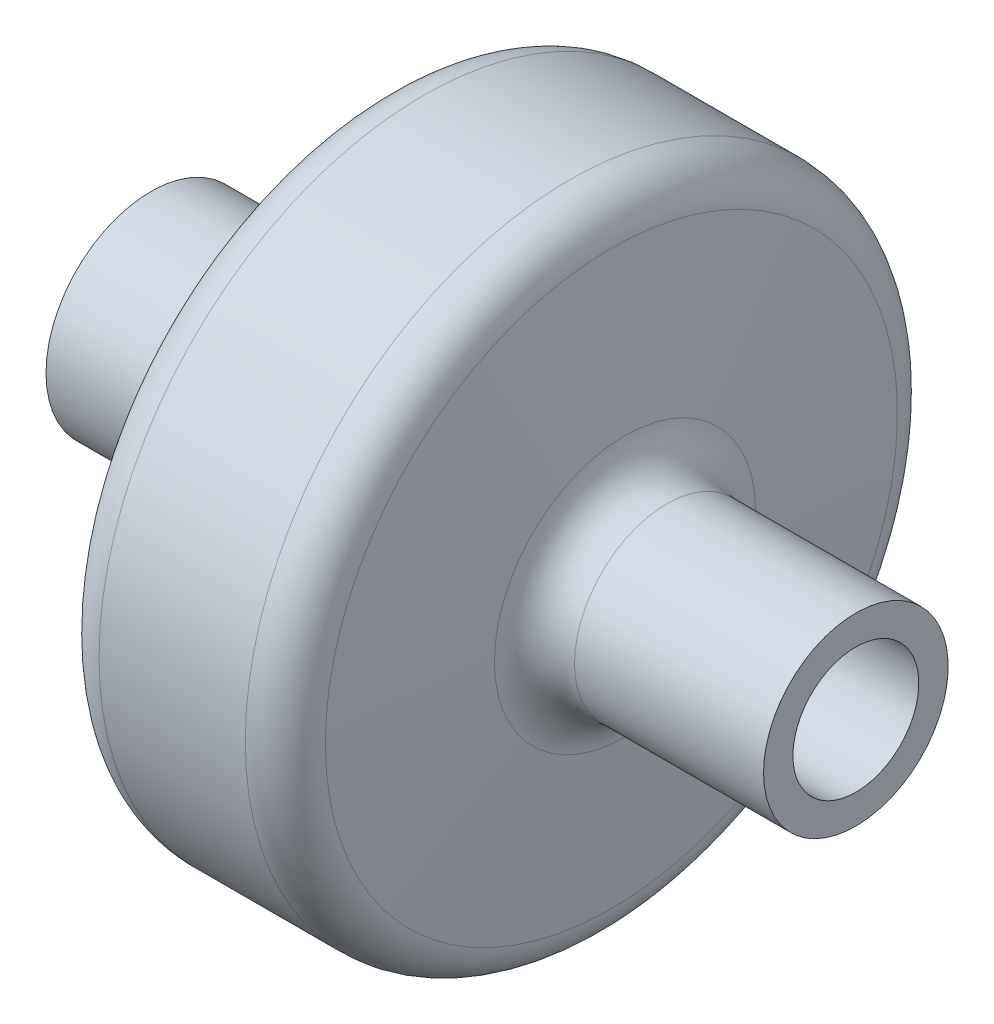
ISO-10303-21;
HEADER;
FILE_DESCRIPTION(('STEP AP214'),'2;1');
FILE_NAME('part.step','',(''),(''),'','','');
FILE_SCHEMA(('AUTOMOTIVE_DESIGN { 1 0 10303 214 1 1 1 1 }'));
ENDSEC;
DATA;
#1=APPLICATION_CONTEXT('core data for automotive mechanical design processes');
#2=APPLICATION_PROTOCOL_DEFINITION('international standard','automotive_design',2000,#1);
#3=PRODUCT_CONTEXT('',#1,'mechanical');
#4=PRODUCT('Part','Part','',(#3));
#5=PRODUCT_RELATED_PRODUCT_CATEGORY('part','',(#4));
#6=PRODUCT_DEFINITION_FORMATION('','',#4);
#7=PRODUCT_DEFINITION_CONTEXT('part definition',#1,'design');
#8=PRODUCT_DEFINITION('design','',#6,#7);
#9=PRODUCT_DEFINITION_SHAPE('','',#8);
#10=(LENGTH_UNIT() NAMED_UNIT(*) SI_UNIT(.MILLI.,.METRE.));
#11=(NAMED_UNIT(*) PLANE_ANGLE_UNIT() SI_UNIT($,.RADIAN.));
#12=(NAMED_UNIT(*) SI_UNIT($,.STERADIAN.) SOLID_ANGLE_UNIT());
#13=UNCERTAINTY_MEASURE_WITH_UNIT(LENGTH_MEASURE(1.E-05),#10,'distance_accuracy_value','');
#14=(GEOMETRIC_REPRESENTATION_CONTEXT(3) GLOBAL_UNCERTAINTY_ASSIGNED_CONTEXT((#13)) GLOBAL_UNIT_ASSIGNED_CONTEXT((#10,
#11,#12)) REPRESENTATION_CONTEXT('',''));
#15=CARTESIAN_POINT('',(0.,0.,0.));
#16=DIRECTION('',(0.,0.,1.));
#17=DIRECTION('',(1.,0.,0.));
#18=AXIS2_PLACEMENT_3D('',#15,#16,#17);
#19=CARTESIAN_POINT('',(-39.9221199652269,0.,0.));
#20=DIRECTION('',(-1.,0.,0.));
#21=DIRECTION('',(0.,0.,1.));
#22=AXIS2_PLACEMENT_3D('',#19,#20,#21);
#23=CYLINDRICAL_SURFACE('',#22,11.);
#24=CARTESIAN_POINT('',(-11.532882958993,0.,0.));
#25=DIRECTION('',(-1.,0.,0.));
#26=DIRECTION('',(0.,0.,1.));
#27=AXIS2_PLACEMENT_3D('',#24,#25,#26);
#28=CIRCLE('',#27,11.);
#29=CARTESIAN_POINT('',(-11.532882958993,0.,11.));
#30=VERTEX_POINT('',#29);
#31=EDGE_CURVE('E10',#30,#30,#28,.T.);
#32=ORIENTED_EDGE('',*,*,#31,.F.);
#33=EDGE_LOOP('',(#32));
#34=FACE_BOUND('',#33,.T.);
#35=CARTESIAN_POINT('',(-40.9418167748256,0.,0.));
#36=DIRECTION('',(-1.,0.,0.));
#37=DIRECTION('',(0.,0.,1.));
#38=AXIS2_PLACEMENT_3D('',#35,#36,#37);
#39=CIRCLE('',#38,11.);
#40=CARTESIAN_POINT('',(-40.9418167748256,0.,11.));
#41=VERTEX_POINT('',#40);
#42=EDGE_CURVE('E91',#41,#41,#39,.T.);
#43=ORIENTED_EDGE('',*,*,#42,.T.);
#44=EDGE_LOOP('',(#43));
#45=FACE_BOUND('',#44,.T.);
#46=ADVANCED_FACE('F33',(#34,#45),#23,.F.);
#47=CARTESIAN_POINT('',(-11.532882958993,31.65,0.));
#48=DIRECTION('',(-1.,0.,0.));
#49=DIRECTION('',(0.,0.,1.));
#50=AXIS2_PLACEMENT_3D('',#47,#48,#49);
#51=PLANE('',#50);
#52=CARTESIAN_POINT('',(-11.532882958993,0.,0.));
#53=DIRECTION('',(-1.,0.,0.));
#54=DIRECTION('',(0.,0.,1.));
#55=AXIS2_PLACEMENT_3D('',#52,#53,#54);
#56=CIRCLE('',#55,31.65);
#57=CARTESIAN_POINT('',(-11.532882958993,0.,31.65));
#58=VERTEX_POINT('',#57);
#59=EDGE_CURVE('E39',#58,#58,#56,.T.);
#60=ORIENTED_EDGE('',*,*,#59,.F.);
#61=EDGE_LOOP('',(#60));
#62=FACE_BOUND('',#61,.T.);
#63=ORIENTED_EDGE('',*,*,#31,.T.);
#64=EDGE_LOOP('',(#63));
#65=FACE_BOUND('',#64,.T.);
#66=ADVANCED_FACE('F188',(#62,#65),#51,.F.);
#67=CARTESIAN_POINT('',(-6.53288295899301,0.,0.));
#68=DIRECTION('',(-1.,0.,0.));
#69=DIRECTION('',(0.,0.,1.));
#70=AXIS2_PLACEMENT_3D('',#67,#68,#69);
#71=TOROIDAL_SURFACE('',#70,31.65,5.);
#72=CARTESIAN_POINT('',(-6.53288295899301,0.,0.));
#73=DIRECTION('',(-1.,0.,0.));
#74=DIRECTION('',(0.,0.,1.));
#75=AXIS2_PLACEMENT_3D('',#72,#73,#74);
#76=CIRCLE('',#75,36.65);
#77=CARTESIAN_POINT('',(-6.53288295899301,0.,36.65));
#78=VERTEX_POINT('',#77);
#79=EDGE_CURVE('E43',#78,#78,#76,.T.);
#80=ORIENTED_EDGE('',*,*,#79,.F.);
#81=EDGE_LOOP('',(#80));
#82=FACE_BOUND('',#81,.T.);
#83=ORIENTED_EDGE('',*,*,#59,.T.);
#84=EDGE_LOOP('',(#83));
#85=FACE_BOUND('',#84,.T.);
#86=ADVANCED_FACE('F183',(#82,#85),#71,.F.);
#87=CARTESIAN_POINT('',(-39.9221199652269,0.,0.));
#88=DIRECTION('',(-1.,0.,0.));
#89=DIRECTION('',(0.,0.,1.));
#90=AXIS2_PLACEMENT_3D('',#87,#88,#89);
#91=CYLINDRICAL_SURFACE('',#90,36.65);
#92=CARTESIAN_POINT('',(6.53288295899301,0.,0.));
#93=DIRECTION('',(-1.,0.,0.));
#94=DIRECTION('',(0.,0.,1.));
#95=AXIS2_PLACEMENT_3D('',#92,#93,#94);
#96=CIRCLE('',#95,36.65);
#97=CARTESIAN_POINT('',(6.53288295899301,0.,36.65));
#98=VERTEX_POINT('',#97);
#99=EDGE_CURVE('E47',#98,#98,#96,.T.);
#100=ORIENTED_EDGE('',*,*,#99,.F.);
#101=EDGE_LOOP('',(#100));
#102=FACE_BOUND('',#101,.T.);
#103=ORIENTED_EDGE('',*,*,#79,.T.);
#104=EDGE_LOOP('',(#103));
#105=FACE_BOUND('',#104,.T.);
#106=ADVANCED_FACE('F177',(#102,#105),#91,.F.);
#107=CARTESIAN_POINT('',(6.53288295899301,0.,0.));
#108=DIRECTION('',(-1.,0.,0.));
#109=DIRECTION('',(0.,0.,1.));
#110=AXIS2_PLACEMENT_3D('',#107,#108,#109);
#111=TOROIDAL_SURFACE('',#110,31.65,5.);
#112=CARTESIAN_POINT('',(11.532882958993,0.,0.));
#113=DIRECTION('',(-1.,0.,0.));
#114=DIRECTION('',(0.,0.,1.));
#115=AXIS2_PLACEMENT_3D('',#112,#113,#114);
#116=CIRCLE('',#115,31.65);
#117=CARTESIAN_POINT('',(11.532882958993,0.,31.65));
#118=VERTEX_POINT('',#117);
#119=EDGE_CURVE('E52',#118,#118,#116,.T.);
#120=ORIENTED_EDGE('',*,*,#119,.F.);
#121=EDGE_LOOP('',(#120));
#122=FACE_BOUND('',#121,.T.);
#123=ORIENTED_EDGE('',*,*,#99,.T.);
#124=EDGE_LOOP('',(#123));
#125=FACE_BOUND('',#124,.T.);
#126=ADVANCED_FACE('F171',(#122,#125),#111,.F.);
#127=CARTESIAN_POINT('',(11.532882958993,31.65,0.));
#128=DIRECTION('',(1.,0.,0.));
#129=DIRECTION('',(0.,0.,-1.));
#130=AXIS2_PLACEMENT_3D('',#127,#128,#129);
#131=PLANE('',#130);
#132=CARTESIAN_POINT('',(11.532882958993,0.,0.));
#133=DIRECTION('',(-1.,0.,0.));
#134=DIRECTION('',(0.,0.,1.));
#135=AXIS2_PLACEMENT_3D('',#132,#133,#134);
#136=CIRCLE('',#135,7.5);
#137=CARTESIAN_POINT('',(11.532882958993,0.,7.5));
#138=VERTEX_POINT('',#137);
#139=EDGE_CURVE('E55',#138,#138,#136,.T.);
#140=ORIENTED_EDGE('',*,*,#139,.F.);
#141=EDGE_LOOP('',(#140));
#142=FACE_BOUND('',#141,.T.);
#143=ORIENTED_EDGE('',*,*,#119,.T.);
#144=EDGE_LOOP('',(#143));
#145=FACE_BOUND('',#144,.T.);
#146=ADVANCED_FACE('F165',(#142,#145),#131,.F.);
#147=CARTESIAN_POINT('',(-39.9221199652269,0.,0.));
#148=DIRECTION('',(-1.,0.,0.));
#149=DIRECTION('',(0.,0.,1.));
#150=AXIS2_PLACEMENT_3D('',#147,#148,#149);
#151=CYLINDRICAL_SURFACE('',#150,7.5);
#152=CARTESIAN_POINT('',(43.0581832251744,0.,0.));
#153=DIRECTION('',(-1.,0.,0.));
#154=DIRECTION('',(0.,0.,1.));
#155=AXIS2_PLACEMENT_3D('',#152,#153,#154);
#156=CIRCLE('',#155,7.5);
#157=CARTESIAN_POINT('',(43.0581832251744,0.,7.5));
#158=VERTEX_POINT('',#157);
#159=EDGE_CURVE('E58',#158,#158,#156,.T.);
#160=ORIENTED_EDGE('',*,*,#159,.F.);
#161=EDGE_LOOP('',(#160));
#162=FACE_BOUND('',#161,.T.);
#163=ORIENTED_EDGE('',*,*,#139,.T.);
#164=EDGE_LOOP('',(#163));
#165=FACE_BOUND('',#164,.T.);
#166=ADVANCED_FACE('F159',(#162,#165),#151,.F.);
#167=CARTESIAN_POINT('',(43.0581832251744,7.5,0.));
#168=DIRECTION('',(-1.,0.,0.));
#169=DIRECTION('',(0.,0.,1.));
#170=AXIS2_PLACEMENT_3D('',#167,#168,#169);
#171=PLANE('',#170);
#172=CARTESIAN_POINT('',(43.0581832251744,0.,0.));
#173=DIRECTION('',(-1.,0.,0.));
#174=DIRECTION('',(0.,0.,1.));
#175=AXIS2_PLACEMENT_3D('',#172,#173,#174);
#176=CIRCLE('',#175,11.);
#177=CARTESIAN_POINT('',(43.0581832251744,0.,11.));
#178=VERTEX_POINT('',#177);
#179=EDGE_CURVE('E61',#178,#178,#176,.T.);
#180=ORIENTED_EDGE('',*,*,#179,.F.);
#181=EDGE_LOOP('',(#180));
#182=FACE_BOUND('',#181,.T.);
#183=ORIENTED_EDGE('',*,*,#159,.T.);
#184=EDGE_LOOP('',(#183));
#185=FACE_BOUND('',#184,.T.);
#186=ADVANCED_FACE('F153',(#182,#185),#171,.F.);
#187=CARTESIAN_POINT('',(-39.9221199652269,0.,0.));
#188=DIRECTION('',(-1.,0.,0.));
#189=DIRECTION('',(0.,0.,1.));
#190=AXIS2_PLACEMENT_3D('',#187,#188,#189);
#191=CYLINDRICAL_SURFACE('',#190,11.);
#192=CARTESIAN_POINT('',(20.5336003755717,0.,0.));
#193=DIRECTION('',(-1.,0.,0.));
#194=DIRECTION('',(0.,0.,1.));
#195=AXIS2_PLACEMENT_3D('',#192,#193,#194);
#196=CIRCLE('',#195,11.);
#197=CARTESIAN_POINT('',(20.5336003755717,0.,11.));
#198=VERTEX_POINT('',#197);
#199=EDGE_CURVE('E64',#198,#198,#196,.T.);
#200=ORIENTED_EDGE('',*,*,#199,.F.);
#201=EDGE_LOOP('',(#200));
#202=FACE_BOUND('',#201,.T.);
#203=ORIENTED_EDGE('',*,*,#179,.T.);
#204=EDGE_LOOP('',(#203));
#205=FACE_BOUND('',#204,.T.);
#206=ADVANCED_FACE('F147',(#202,#205),#191,.T.);
#207=CARTESIAN_POINT('',(20.5336003755717,0.,0.));
#208=DIRECTION('',(-1.,0.,0.));
#209=DIRECTION('',(0.,0.,1.));
#210=AXIS2_PLACEMENT_3D('',#207,#208,#209);
#211=TOROIDAL_SURFACE('',#210,16.,5.);
#212=CARTESIAN_POINT('',(15.552626885113,0.,0.));
#213=DIRECTION('',(-1.,0.,0.));
#214=DIRECTION('',(0.,0.,1.));
#215=AXIS2_PLACEMENT_3D('',#212,#213,#214);
#216=CIRCLE('',#215,15.5642212862617);
#217=CARTESIAN_POINT('',(15.552626885113,0.,15.5642212862617));
#218=VERTEX_POINT('',#217);
#219=EDGE_CURVE('E67',#218,#218,#216,.T.);
#220=ORIENTED_EDGE('',*,*,#219,.F.);
#221=EDGE_LOOP('',(#220));
#222=FACE_BOUND('',#221,.T.);
#223=ORIENTED_EDGE('',*,*,#199,.T.);
#224=EDGE_LOOP('',(#223));
#225=FACE_BOUND('',#224,.T.);
#226=ADVANCED_FACE('F141',(#222,#225),#211,.F.);
#227=CARTESIAN_POINT('',(15.552626885113,0.,0.));
#228=DIRECTION('',(-1.,0.,0.));
#229=DIRECTION('',(0.,0.,1.));
#230=AXIS2_PLACEMENT_3D('',#227,#228,#229);
#231=CONICAL_SURFACE('',#230,15.5642212862617,1.48352986419519);
#232=CARTESIAN_POINT('',(13.9322005793646,0.,0.));
#233=DIRECTION('',(-1.,0.,0.));
#234=DIRECTION('',(0.,0.,1.));
#235=AXIS2_PLACEMENT_3D('',#232,#233,#234);
#236=CIRCLE('',#235,34.0857787137382);
#237=CARTESIAN_POINT('',(13.9322005793646,0.,34.0857787137382));
#238=VERTEX_POINT('',#237);
#239=EDGE_CURVE('E70',#238,#238,#236,.T.);
#240=ORIENTED_EDGE('',*,*,#239,.F.);
#241=EDGE_LOOP('',(#240));
#242=FACE_BOUND('',#241,.T.);
#243=ORIENTED_EDGE('',*,*,#219,.T.);
#244=EDGE_LOOP('',(#243));
#245=FACE_BOUND('',#244,.T.);
#246=ADVANCED_FACE('F135',(#242,#245),#231,.T.);
#247=CARTESIAN_POINT('',(8.95122708890586,0.,0.));
#248=DIRECTION('',(-1.,0.,0.));
#249=DIRECTION('',(0.,0.,1.));
#250=AXIS2_PLACEMENT_3D('',#247,#248,#249);
#251=TOROIDAL_SURFACE('',#250,33.65,5.);
#252=CARTESIAN_POINT('',(8.95122708890585,0.,0.));
#253=DIRECTION('',(-1.,0.,0.));
#254=DIRECTION('',(0.,0.,1.));
#255=AXIS2_PLACEMENT_3D('',#252,#253,#254);
#256=CIRCLE('',#255,38.65);
#257=CARTESIAN_POINT('',(8.95122708890585,0.,38.65));
#258=VERTEX_POINT('',#257);
#259=EDGE_CURVE('E73',#258,#258,#256,.T.);
#260=ORIENTED_EDGE('',*,*,#259,.F.);
#261=EDGE_LOOP('',(#260));
#262=FACE_BOUND('',#261,.T.);
#263=ORIENTED_EDGE('',*,*,#239,.T.);
#264=EDGE_LOOP('',(#263));
#265=FACE_BOUND('',#264,.T.);
#266=ADVANCED_FACE('F129',(#262,#265),#251,.T.);
#267=CARTESIAN_POINT('',(-39.9221199652269,0.,0.));
#268=DIRECTION('',(-1.,0.,0.));
#269=DIRECTION('',(0.,0.,1.));
#270=AXIS2_PLACEMENT_3D('',#267,#268,#269);
#271=CYLINDRICAL_SURFACE('',#270,38.65);
#272=CARTESIAN_POINT('',(-8.47182339016084,0.,0.));
#273=DIRECTION('',(-1.,0.,0.));
#274=DIRECTION('',(0.,0.,1.));
#275=AXIS2_PLACEMENT_3D('',#272,#273,#274);
#276=CIRCLE('',#275,38.65);
#277=CARTESIAN_POINT('',(-8.47182339016084,0.,38.65));
#278=VERTEX_POINT('',#277);
#279=EDGE_CURVE('E76',#278,#278,#276,.T.);
#280=ORIENTED_EDGE('',*,*,#279,.F.);
#281=EDGE_LOOP('',(#280));
#282=FACE_BOUND('',#281,.T.);
#283=ORIENTED_EDGE('',*,*,#259,.T.);
#284=EDGE_LOOP('',(#283));
#285=FACE_BOUND('',#284,.T.);
#286=ADVANCED_FACE('F123',(#282,#285),#271,.T.);
#287=CARTESIAN_POINT('',(-8.47182339016084,0.,0.));
#288=DIRECTION('',(-1.,0.,0.));
#289=DIRECTION('',(0.,0.,1.));
#290=AXIS2_PLACEMENT_3D('',#287,#288,#289);
#291=TOROIDAL_SURFACE('',#290,33.65,5.);
#292=CARTESIAN_POINT('',(-13.4527968806196,0.,0.));
#293=DIRECTION('',(-1.,0.,0.));
#294=DIRECTION('',(0.,0.,1.));
#295=AXIS2_PLACEMENT_3D('',#292,#293,#294);
#296=CIRCLE('',#295,34.0857787137383);
#297=CARTESIAN_POINT('',(-13.4527968806196,0.,34.0857787137383));
#298=VERTEX_POINT('',#297);
#299=EDGE_CURVE('E79',#298,#298,#296,.T.);
#300=ORIENTED_EDGE('',*,*,#299,.F.);
#301=EDGE_LOOP('',(#300));
#302=FACE_BOUND('',#301,.T.);
#303=ORIENTED_EDGE('',*,*,#279,.T.);
#304=EDGE_LOOP('',(#303));
#305=FACE_BOUND('',#304,.T.);
#306=ADVANCED_FACE('F117',(#302,#305),#291,.T.);
#307=CARTESIAN_POINT('',(-13.4527968806196,0.,0.));
#308=DIRECTION('',(1.,0.,0.));
#309=DIRECTION('',(0.,0.,-1.));
#310=AXIS2_PLACEMENT_3D('',#307,#308,#309);
#311=CONICAL_SURFACE('',#310,34.0857787137383,1.48352986419519);
#312=CARTESIAN_POINT('',(-15.073223186368,0.,0.));
#313=DIRECTION('',(-1.,0.,0.));
#314=DIRECTION('',(0.,0.,1.));
#315=AXIS2_PLACEMENT_3D('',#312,#313,#314);
#316=CIRCLE('',#315,15.5642212862618);
#317=CARTESIAN_POINT('',(-15.073223186368,0.,15.5642212862618));
#318=VERTEX_POINT('',#317);
#319=EDGE_CURVE('E82',#318,#318,#316,.T.);
#320=ORIENTED_EDGE('',*,*,#319,.F.);
#321=EDGE_LOOP('',(#320));
#322=FACE_BOUND('',#321,.T.);
#323=ORIENTED_EDGE('',*,*,#299,.T.);
#324=EDGE_LOOP('',(#323));
#325=FACE_BOUND('',#324,.T.);
#326=ADVANCED_FACE('F111',(#322,#325),#311,.T.);
#327=CARTESIAN_POINT('',(-18.4172339252229,0.,0.));
#328=DIRECTION('',(-1.,0.,0.));
#329=DIRECTION('',(0.,0.,1.));
#330=AXIS2_PLACEMENT_3D('',#327,#328,#329);
#331=TOROIDAL_SURFACE('',#330,15.8567843166205,3.35678431662049);
#332=CARTESIAN_POINT('',(-18.4172339252229,0.,0.));
#333=DIRECTION('',(-1.,0.,0.));
#334=DIRECTION('',(0.,0.,1.));
#335=AXIS2_PLACEMENT_3D('',#332,#333,#334);
#336=CIRCLE('',#335,12.5);
#337=CARTESIAN_POINT('',(-18.4172339252229,0.,12.5));
#338=VERTEX_POINT('',#337);
#339=EDGE_CURVE('E85',#338,#338,#336,.T.);
#340=ORIENTED_EDGE('',*,*,#339,.F.);
#341=EDGE_LOOP('',(#340));
#342=FACE_BOUND('',#341,.T.);
#343=ORIENTED_EDGE('',*,*,#319,.T.);
#344=EDGE_LOOP('',(#343));
#345=FACE_BOUND('',#344,.T.);
#346=ADVANCED_FACE('F105',(#342,#345),#331,.F.);
#347=CARTESIAN_POINT('',(-39.9221199652269,0.,0.));
#348=DIRECTION('',(-1.,0.,0.));
#349=DIRECTION('',(0.,0.,1.));
#350=AXIS2_PLACEMENT_3D('',#347,#348,#349);
#351=CYLINDRICAL_SURFACE('',#350,12.5);
#352=CARTESIAN_POINT('',(-40.9418167748256,0.,0.));
#353=DIRECTION('',(-1.,0.,0.));
#354=DIRECTION('',(0.,0.,1.));
#355=AXIS2_PLACEMENT_3D('',#352,#353,#354);
#356=CIRCLE('',#355,12.5);
#357=CARTESIAN_POINT('',(-40.9418167748256,0.,12.5));
#358=VERTEX_POINT('',#357);
#359=EDGE_CURVE('E88',#358,#358,#356,.T.);
#360=ORIENTED_EDGE('',*,*,#359,.F.);
#361=EDGE_LOOP('',(#360));
#362=FACE_BOUND('',#361,.T.);
#363=ORIENTED_EDGE('',*,*,#339,.T.);
#364=EDGE_LOOP('',(#363));
#365=FACE_BOUND('',#364,.T.);
#366=ADVANCED_FACE('F99',(#362,#365),#351,.T.);
#367=CARTESIAN_POINT('',(-40.9418167748256,12.5,0.));
#368=DIRECTION('',(1.,0.,0.));
#369=DIRECTION('',(0.,0.,-1.));
#370=AXIS2_PLACEMENT_3D('',#367,#368,#369);
#371=PLANE('',#370);
#372=ORIENTED_EDGE('',*,*,#42,.F.);
#373=EDGE_LOOP('',(#372));
#374=FACE_BOUND('',#373,.T.);
#375=ORIENTED_EDGE('',*,*,#359,.T.);
#376=EDGE_LOOP('',(#375));
#377=FACE_BOUND('',#376,.T.);
#378=ADVANCED_FACE('F96',(#374,#377),#371,.F.);
#379=CLOSED_SHELL('',(#46,#66,#86,#106,#126,#146,#166,#186,#206,#226,#246,#266,#286,#306,#326,
#346,#366,#378));
#380=MANIFOLD_SOLID_BREP('B2',#379);
#381=ADVANCED_BREP_SHAPE_REPRESENTATION('',(#18,#380),#14);
#382=SHAPE_DEFINITION_REPRESENTATION(#9,#381);
ENDSEC;
END-ISO-10303-21;
